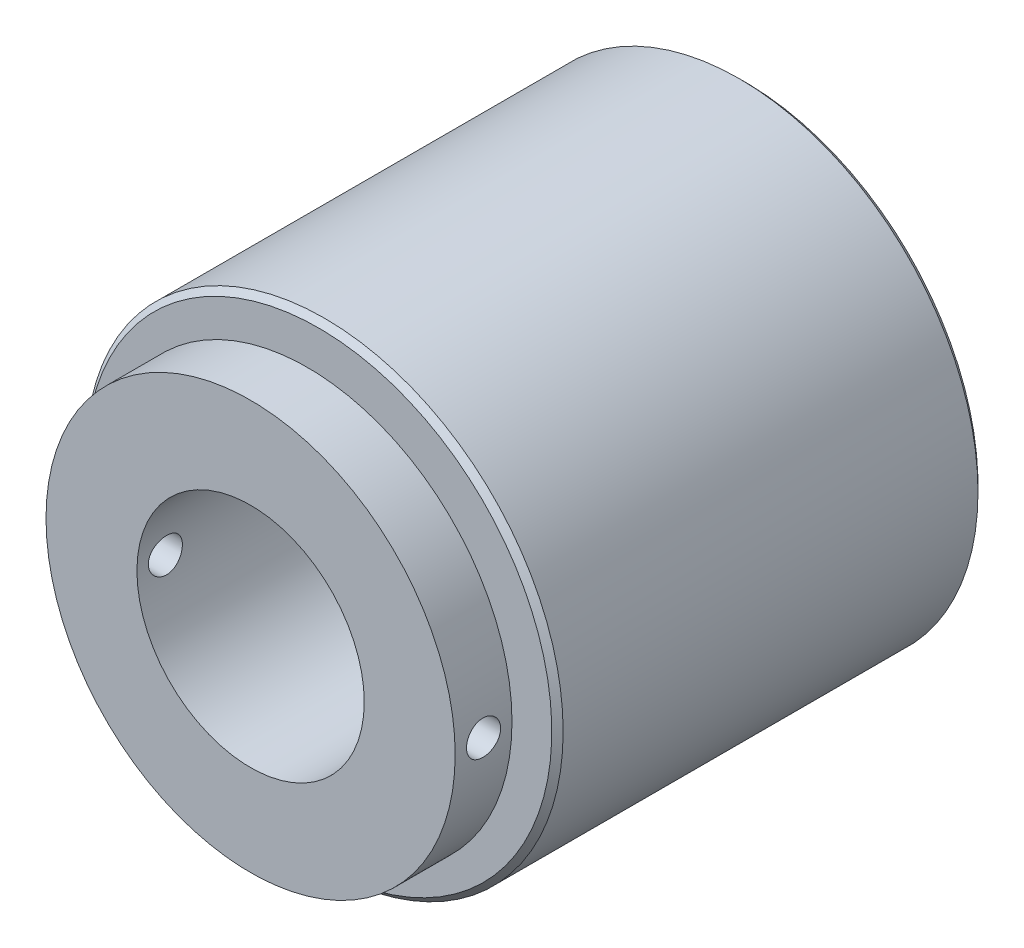
ISO-10303-21;
HEADER;
FILE_DESCRIPTION(('STEP AP214'),'2;1');
FILE_NAME('part.step','',(''),(''),'','','');
FILE_SCHEMA(('AUTOMOTIVE_DESIGN { 1 0 10303 214 1 1 1 1 }'));
ENDSEC;
DATA;
#1=APPLICATION_CONTEXT('core data for automotive mechanical design processes');
#2=APPLICATION_PROTOCOL_DEFINITION('international standard','automotive_design',2000,#1);
#3=PRODUCT_CONTEXT('',#1,'mechanical');
#4=PRODUCT('Part','Part','',(#3));
#5=PRODUCT_RELATED_PRODUCT_CATEGORY('part','',(#4));
#6=PRODUCT_DEFINITION_FORMATION('','',#4);
#7=PRODUCT_DEFINITION_CONTEXT('part definition',#1,'design');
#8=PRODUCT_DEFINITION('design','',#6,#7);
#9=PRODUCT_DEFINITION_SHAPE('','',#8);
#10=(LENGTH_UNIT() NAMED_UNIT(*) SI_UNIT(.MILLI.,.METRE.));
#11=(NAMED_UNIT(*) PLANE_ANGLE_UNIT() SI_UNIT($,.RADIAN.));
#12=(NAMED_UNIT(*) SI_UNIT($,.STERADIAN.) SOLID_ANGLE_UNIT());
#13=UNCERTAINTY_MEASURE_WITH_UNIT(LENGTH_MEASURE(1.E-05),#10,'distance_accuracy_value','');
#14=(GEOMETRIC_REPRESENTATION_CONTEXT(3) GLOBAL_UNCERTAINTY_ASSIGNED_CONTEXT((#13)) GLOBAL_UNIT_ASSIGNED_CONTEXT((#10,
#11,#12)) REPRESENTATION_CONTEXT('',''));
#15=CARTESIAN_POINT('',(0.,0.,0.));
#16=DIRECTION('',(0.,0.,1.));
#17=DIRECTION('',(1.,0.,0.));
#18=AXIS2_PLACEMENT_3D('',#15,#16,#17);
#19=CARTESIAN_POINT('',(0.,0.,5.));
#20=DIRECTION('',(0.,0.,-1.));
#21=DIRECTION('',(-1.,0.,0.));
#22=AXIS2_PLACEMENT_3D('',#19,#20,#21);
#23=CYLINDRICAL_SURFACE('',#22,18.);
#24=CARTESIAN_POINT('',(0.,0.,5.));
#25=DIRECTION('',(0.,0.,1.));
#26=DIRECTION('',(1.,0.,0.));
#27=AXIS2_PLACEMENT_3D('',#24,#25,#26);
#28=CIRCLE('',#27,18.);
#29=CARTESIAN_POINT('',(18.,0.,5.));
#30=VERTEX_POINT('',#29);
#31=EDGE_CURVE('E225',#30,#30,#28,.T.);
#32=ORIENTED_EDGE('',*,*,#31,.F.);
#33=EDGE_LOOP('',(#32));
#34=FACE_BOUND('',#33,.T.);
#35=CARTESIAN_POINT('',(0.,0.,0.));
#36=DIRECTION('',(0.,0.,1.));
#37=DIRECTION('',(1.,0.,0.));
#38=AXIS2_PLACEMENT_3D('',#35,#36,#37);
#39=CIRCLE('',#38,18.);
#40=CARTESIAN_POINT('',(18.,0.,0.));
#41=VERTEX_POINT('',#40);
#42=EDGE_CURVE('E223',#41,#41,#39,.T.);
#43=ORIENTED_EDGE('',*,*,#42,.T.);
#44=EDGE_LOOP('',(#43));
#45=FACE_BOUND('',#44,.T.);
#46=CARTESIAN_POINT('',(18.,0.,4.));
#47=CARTESIAN_POINT('',(17.9999991811727,-0.0840991348818064,3.99999632676058));
#48=CARTESIAN_POINT('',(17.9994043281509,-0.168255520770338,3.99290354528343));
#49=CARTESIAN_POINT('',(17.9970885349237,-0.334239856050584,3.96471347221738));
#50=CARTESIAN_POINT('',(17.9953663189754,-0.416065057837845,3.94360031454265));
#51=CARTESIAN_POINT('',(17.9909904186916,-0.574959033771391,3.88798426928595));
#52=CARTESIAN_POINT('',(17.9883372614773,-0.652030470636923,3.85348895783527));
#53=CARTESIAN_POINT('',(17.9823970161707,-0.799270850124114,3.77210135219201));
#54=CARTESIAN_POINT('',(17.9791100637204,-0.869441264828083,3.72521170978374));
#55=CARTESIAN_POINT('',(17.9722616980007,-1.00108499994839,3.62023740009101));
#56=CARTESIAN_POINT('',(17.9686996812986,-1.06253830862424,3.56212767409647));
#57=CARTESIAN_POINT('',(17.9617077120475,-1.17483170030483,3.4364156562251));
#58=CARTESIAN_POINT('',(17.9582777653056,-1.22567131705726,3.36881294754607));
#59=CARTESIAN_POINT('',(17.9519317899186,-1.31536188358534,3.22591282435146));
#60=CARTESIAN_POINT('',(17.9490165177014,-1.35419524942731,3.15060433689584));
#61=CARTESIAN_POINT('',(17.9440368667241,-1.41865865066077,2.99450755666603));
#62=CARTESIAN_POINT('',(17.9419724729345,-1.44428891926863,2.91371936071262));
#63=CARTESIAN_POINT('',(17.9389333809948,-1.48156054472786,2.74915691217823));
#64=CARTESIAN_POINT('',(17.9379561440433,-1.49323449808466,2.6653900900111));
#65=CARTESIAN_POINT('',(17.9371939848221,-1.50236281202314,2.49708069408195));
#66=CARTESIAN_POINT('',(17.9374090401759,-1.49981743946931,2.4125381349085));
#67=CARTESIAN_POINT('',(17.9390048604246,-1.48060629632227,2.24530050173422));
#68=CARTESIAN_POINT('',(17.9403827006678,-1.46397595205709,2.16260132638538));
#69=CARTESIAN_POINT('',(17.9441442535405,-1.41712197807441,2.00117219891057));
#70=CARTESIAN_POINT('',(17.946527975994,-1.38689821559518,1.92244228555922));
#71=CARTESIAN_POINT('',(17.9520360706028,-1.31367568222805,1.77107364118285));
#72=CARTESIAN_POINT('',(17.9551613632645,-1.27066101713579,1.69844263361874));
#73=CARTESIAN_POINT('',(17.9617996029582,-1.17308916587002,1.56141799177029));
#74=CARTESIAN_POINT('',(17.9653125578405,-1.11853174593381,1.49702452435418));
#75=CARTESIAN_POINT('',(17.9723433061747,-0.999224373339545,1.37809687107765));
#76=CARTESIAN_POINT('',(17.975861081626,-0.934443794085863,1.32359340380612));
#77=CARTESIAN_POINT('',(17.9824948780475,-0.796635834557626,1.22623041491717));
#78=CARTESIAN_POINT('',(17.9856108987493,-0.723608448773006,1.18337090107966));
#79=CARTESIAN_POINT('',(17.9910906871446,-0.571359889901777,1.11051435599694));
#80=CARTESIAN_POINT('',(17.9934543752616,-0.492138062713611,1.08051868528277));
#81=CARTESIAN_POINT('',(17.997162261177,-0.329758603529373,1.03426280132301));
#82=CARTESIAN_POINT('',(17.9985064801333,-0.246601053253283,1.01800230301711));
#83=CARTESIAN_POINT('',(18.0000212541458,-0.0789769502463765,0.999716853937632));
#84=CARTESIAN_POINT('',(18.00019530738,0.00548494367279381,0.997649472839654));
#85=CARTESIAN_POINT('',(17.9993594816805,0.173554128754955,1.00769779094097));
#86=CARTESIAN_POINT('',(17.9983496137901,0.257161427882119,1.01981335784419));
#87=CARTESIAN_POINT('',(17.9952617676198,0.421027134337049,1.05784848791514));
#88=CARTESIAN_POINT('',(17.9931853112613,0.501290137709583,1.08374838403872));
#89=CARTESIAN_POINT('',(17.9881975516853,0.656331247623733,1.14859688167304));
#90=CARTESIAN_POINT('',(17.9852862352686,0.731109267424698,1.18754568948775));
#91=CARTESIAN_POINT('',(17.9789463959045,0.87325082745286,1.27749302382453));
#92=CARTESIAN_POINT('',(17.9755166732811,0.940596525782204,1.32851965959224));
#93=CARTESIAN_POINT('',(17.9685293795955,1.06578164226543,1.44113358557572));
#94=CARTESIAN_POINT('',(17.9649718063129,1.12362089522157,1.5027210592739));
#95=CARTESIAN_POINT('',(17.9581194182373,1.22829681818265,1.63489253829751));
#96=CARTESIAN_POINT('',(17.9548252781133,1.27510579985046,1.7054985117961));
#97=CARTESIAN_POINT('',(17.9488822761648,1.35620259425928,1.85359339429512));
#98=CARTESIAN_POINT('',(17.9462334078977,1.39049053201495,1.93108223456491));
#99=CARTESIAN_POINT('',(17.9418846427341,1.44552476616085,2.09064518580886));
#100=CARTESIAN_POINT('',(17.9401835584295,1.46628801217393,2.1727134170715));
#101=CARTESIAN_POINT('',(17.9379189853628,1.49373865486523,2.33918604981164));
#102=CARTESIAN_POINT('',(17.9373554747545,1.5004263218524,2.42359040639439));
#103=CARTESIAN_POINT('',(17.9374301692529,1.4995328443364,2.59206418903134));
#104=CARTESIAN_POINT('',(17.938064710396,1.49199520466609,2.67613385085466));
#105=CARTESIAN_POINT('',(17.9404562262346,1.46295579494255,2.84180880032628));
#106=CARTESIAN_POINT('',(17.9422132026419,1.44145400359144,2.92341408421576));
#107=CARTESIAN_POINT('',(17.9466506569756,1.38510766502559,3.08184664489993));
#108=CARTESIAN_POINT('',(17.9493310806928,1.3502639010098,3.15867420184853));
#109=CARTESIAN_POINT('',(17.955313498126,1.26822758842088,3.3053962608605));
#110=CARTESIAN_POINT('',(17.9586154820857,1.22103523367184,3.37529087171999));
#111=CARTESIAN_POINT('',(17.9654809754802,1.11547791318367,3.50638560851952));
#112=CARTESIAN_POINT('',(17.9690452200862,1.05708074061219,3.56755976298602));
#113=CARTESIAN_POINT('',(17.9760269251452,0.930829838388698,3.67926277780498));
#114=CARTESIAN_POINT('',(17.9794443498724,0.862973823961637,3.72978905874402));
#115=CARTESIAN_POINT('',(17.9857535226341,0.719600659544122,3.81882979062634));
#116=CARTESIAN_POINT('',(17.9886442803466,0.644069484405807,3.85732170798449));
#117=CARTESIAN_POINT('',(17.9935627877445,0.4876436279936,3.92102770457692));
#118=CARTESIAN_POINT('',(17.9955915289238,0.406755233120476,3.94625704643216));
#119=CARTESIAN_POINT('',(17.9980366160078,0.271158072145019,3.97629637375307));
#120=CARTESIAN_POINT('',(17.9987695331543,0.217321341657706,3.98517341877623));
#121=CARTESIAN_POINT('',(17.9997514898795,0.108997757251744,3.99702641451581));
#122=CARTESIAN_POINT('',(18.0000005307429,0.0545109050595675,4.0000023808997));
#123=CARTESIAN_POINT('',(18.,0.,4.));
#124=B_SPLINE_CURVE_WITH_KNOTS('',3,(#46,#47,#48,#49,#50,#51,#52,#53,#54,#55,#56,#57,#58,#59,
#60,#61,#62,#63,#64,#65,#66,#67,#68,#69,#70,#71,#72,#73,#74,#75,#76,#77,#78,#79,#80,#81,#82,#83,
#84,#85,#86,#87,#88,#89,#90,#91,#92,#93,#94,#95,#96,#97,#98,#99,#100,#101,#102,#103,#104,#105,
#106,#107,#108,#109,#110,#111,#112,#113,#114,#115,#116,#117,#118,#119,#120,#121,#122,#123),
.UNSPECIFIED.,.T.,.F.,(4,2,2,2,2,2,2,2,2,2,2,2,2,2,2,2,2,2,2,2,2,2,2,2,2,2,2,2,2,2,2,2,2,2,2,2,
2,2,4),(0.,0.252098380200209,0.504482533496753,0.756724010833431,1.00891156437627,
1.26166900317865,1.51443754310897,1.76757454426637,2.02070707391851,2.2732472224738,
2.52578263143928,2.77768474665434,3.02958932215498,3.28180823623349,3.5340322587129,
3.78702676402724,4.04002143837967,4.29304286385676,4.54605903798802,4.79831848960753,
5.05057558821332,5.30247373546178,5.55437586542058,5.8068701246239,6.05936877106876,
6.31249464736803,6.56561799629742,6.81842350861393,7.07122416598137,7.32325294323791,
7.5752821048851,7.82729647421284,8.07930688814784,8.33205282996958,8.58485992848721,
8.8381375959383,9.09112314887678,9.25452729534993,9.41793100798119),.UNSPECIFIED.);
#125=CARTESIAN_POINT('',(18.,0.,4.));
#126=VERTEX_POINT('',#125);
#127=EDGE_CURVE('E88',#126,#126,#124,.T.);
#128=ORIENTED_EDGE('',*,*,#127,.F.);
#129=EDGE_LOOP('',(#128));
#130=FACE_BOUND('',#129,.T.);
#131=CARTESIAN_POINT('',(-18.,0.,4.));
#132=CARTESIAN_POINT('',(-17.9999991811727,0.0840991348818064,3.99999632676058));
#133=CARTESIAN_POINT('',(-17.9994043281509,0.168255520770338,3.99290354528343));
#134=CARTESIAN_POINT('',(-17.9970885349237,0.334239856050584,3.96471347221738));
#135=CARTESIAN_POINT('',(-17.9953663189754,0.416065057837845,3.94360031454265));
#136=CARTESIAN_POINT('',(-17.9909904186916,0.574959033771391,3.88798426928595));
#137=CARTESIAN_POINT('',(-17.9883372614773,0.652030470636923,3.85348895783527));
#138=CARTESIAN_POINT('',(-17.9823970161707,0.799270850124114,3.77210135219201));
#139=CARTESIAN_POINT('',(-17.9791100637204,0.869441264828083,3.72521170978374));
#140=CARTESIAN_POINT('',(-17.9722616980007,1.00108499994839,3.62023740009101));
#141=CARTESIAN_POINT('',(-17.9686996812986,1.06253830862424,3.56212767409647));
#142=CARTESIAN_POINT('',(-17.9617077120475,1.17483170030483,3.4364156562251));
#143=CARTESIAN_POINT('',(-17.9582777653056,1.22567131705726,3.36881294754607));
#144=CARTESIAN_POINT('',(-17.9519317899186,1.31536188358534,3.22591282435146));
#145=CARTESIAN_POINT('',(-17.9490165177014,1.35419524942731,3.15060433689584));
#146=CARTESIAN_POINT('',(-17.9440368667241,1.41865865066077,2.99450755666603));
#147=CARTESIAN_POINT('',(-17.9419724729345,1.44428891926863,2.91371936071262));
#148=CARTESIAN_POINT('',(-17.9389333809948,1.48156054472786,2.74915691217823));
#149=CARTESIAN_POINT('',(-17.9379561440433,1.49323449808466,2.6653900900111));
#150=CARTESIAN_POINT('',(-17.9371939848221,1.50236281202314,2.49708069408195));
#151=CARTESIAN_POINT('',(-17.9374090401759,1.49981743946931,2.4125381349085));
#152=CARTESIAN_POINT('',(-17.9390048604246,1.48060629632227,2.24530050173422));
#153=CARTESIAN_POINT('',(-17.9403827006678,1.46397595205709,2.16260132638538));
#154=CARTESIAN_POINT('',(-17.9441442535405,1.41712197807441,2.00117219891057));
#155=CARTESIAN_POINT('',(-17.946527975994,1.38689821559518,1.92244228555922));
#156=CARTESIAN_POINT('',(-17.9520360706028,1.31367568222805,1.77107364118285));
#157=CARTESIAN_POINT('',(-17.9551613632645,1.27066101713579,1.69844263361874));
#158=CARTESIAN_POINT('',(-17.9617996029582,1.17308916587002,1.56141799177029));
#159=CARTESIAN_POINT('',(-17.9653125578405,1.11853174593381,1.49702452435418));
#160=CARTESIAN_POINT('',(-17.9723433061747,0.999224373339545,1.37809687107765));
#161=CARTESIAN_POINT('',(-17.975861081626,0.934443794085863,1.32359340380612));
#162=CARTESIAN_POINT('',(-17.9824948780475,0.796635834557626,1.22623041491717));
#163=CARTESIAN_POINT('',(-17.9856108987493,0.723608448773006,1.18337090107966));
#164=CARTESIAN_POINT('',(-17.9910906871446,0.571359889901777,1.11051435599694));
#165=CARTESIAN_POINT('',(-17.9934543752616,0.492138062713611,1.08051868528277));
#166=CARTESIAN_POINT('',(-17.997162261177,0.329758603529373,1.03426280132301));
#167=CARTESIAN_POINT('',(-17.9985064801333,0.246601053253283,1.01800230301711));
#168=CARTESIAN_POINT('',(-18.0000212541458,0.0789769502463765,0.999716853937632));
#169=CARTESIAN_POINT('',(-18.00019530738,-0.00548494367279381,0.997649472839654));
#170=CARTESIAN_POINT('',(-17.9993594816805,-0.173554128754955,1.00769779094097));
#171=CARTESIAN_POINT('',(-17.9983496137901,-0.257161427882119,1.01981335784419));
#172=CARTESIAN_POINT('',(-17.9952617676198,-0.421027134337049,1.05784848791514));
#173=CARTESIAN_POINT('',(-17.9931853112613,-0.501290137709583,1.08374838403872));
#174=CARTESIAN_POINT('',(-17.9881975516853,-0.656331247623733,1.14859688167304));
#175=CARTESIAN_POINT('',(-17.9852862352686,-0.731109267424698,1.18754568948775));
#176=CARTESIAN_POINT('',(-17.9789463959045,-0.87325082745286,1.27749302382453));
#177=CARTESIAN_POINT('',(-17.9755166732811,-0.940596525782204,1.32851965959224));
#178=CARTESIAN_POINT('',(-17.9685293795955,-1.06578164226543,1.44113358557572));
#179=CARTESIAN_POINT('',(-17.9649718063129,-1.12362089522157,1.5027210592739));
#180=CARTESIAN_POINT('',(-17.9581194182373,-1.22829681818265,1.63489253829751));
#181=CARTESIAN_POINT('',(-17.9548252781133,-1.27510579985046,1.7054985117961));
#182=CARTESIAN_POINT('',(-17.9488822761648,-1.35620259425928,1.85359339429512));
#183=CARTESIAN_POINT('',(-17.9462334078977,-1.39049053201495,1.93108223456491));
#184=CARTESIAN_POINT('',(-17.9418846427341,-1.44552476616085,2.09064518580886));
#185=CARTESIAN_POINT('',(-17.9401835584295,-1.46628801217393,2.1727134170715));
#186=CARTESIAN_POINT('',(-17.9379189853628,-1.49373865486523,2.33918604981164));
#187=CARTESIAN_POINT('',(-17.9373554747545,-1.5004263218524,2.42359040639439));
#188=CARTESIAN_POINT('',(-17.9374301692529,-1.4995328443364,2.59206418903134));
#189=CARTESIAN_POINT('',(-17.938064710396,-1.49199520466609,2.67613385085466));
#190=CARTESIAN_POINT('',(-17.9404562262346,-1.46295579494255,2.84180880032628));
#191=CARTESIAN_POINT('',(-17.9422132026419,-1.44145400359144,2.92341408421576));
#192=CARTESIAN_POINT('',(-17.9466506569756,-1.38510766502559,3.08184664489993));
#193=CARTESIAN_POINT('',(-17.9493310806928,-1.3502639010098,3.15867420184853));
#194=CARTESIAN_POINT('',(-17.955313498126,-1.26822758842088,3.3053962608605));
#195=CARTESIAN_POINT('',(-17.9586154820857,-1.22103523367184,3.37529087171999));
#196=CARTESIAN_POINT('',(-17.9654809754802,-1.11547791318367,3.50638560851952));
#197=CARTESIAN_POINT('',(-17.9690452200862,-1.05708074061219,3.56755976298602));
#198=CARTESIAN_POINT('',(-17.9760269251452,-0.930829838388698,3.67926277780498));
#199=CARTESIAN_POINT('',(-17.9794443498724,-0.862973823961637,3.72978905874402));
#200=CARTESIAN_POINT('',(-17.9857535226341,-0.719600659544122,3.81882979062634));
#201=CARTESIAN_POINT('',(-17.9886442803466,-0.644069484405807,3.85732170798449));
#202=CARTESIAN_POINT('',(-17.9935627877445,-0.4876436279936,3.92102770457692));
#203=CARTESIAN_POINT('',(-17.9955915289238,-0.406755233120476,3.94625704643216));
#204=CARTESIAN_POINT('',(-17.9980366160078,-0.271158072145019,3.97629637375307));
#205=CARTESIAN_POINT('',(-17.9987695331543,-0.217321341657706,3.98517341877623));
#206=CARTESIAN_POINT('',(-17.9997514898795,-0.108997757251744,3.99702641451581));
#207=CARTESIAN_POINT('',(-18.0000005307429,-0.0545109050595675,4.0000023808997));
#208=CARTESIAN_POINT('',(-18.,0.,4.));
#209=B_SPLINE_CURVE_WITH_KNOTS('',3,(#131,#132,#133,#134,#135,#136,#137,#138,#139,#140,#141,
#142,#143,#144,#145,#146,#147,#148,#149,#150,#151,#152,#153,#154,#155,#156,#157,#158,#159,#160,
#161,#162,#163,#164,#165,#166,#167,#168,#169,#170,#171,#172,#173,#174,#175,#176,#177,#178,#179,
#180,#181,#182,#183,#184,#185,#186,#187,#188,#189,#190,#191,#192,#193,#194,#195,#196,#197,#198,
#199,#200,#201,#202,#203,#204,#205,#206,#207,#208),.UNSPECIFIED.,.T.,.F.,(4,2,2,2,2,2,2,2,2,2,2,
2,2,2,2,2,2,2,2,2,2,2,2,2,2,2,2,2,2,2,2,2,2,2,2,2,2,2,4),(0.,0.252098380200209,
0.504482533496753,0.756724010833431,1.00891156437627,1.26166900317865,1.51443754310897,
1.76757454426637,2.02070707391851,2.2732472224738,2.52578263143928,2.77768474665434,
3.02958932215498,3.28180823623349,3.5340322587129,3.78702676402724,4.04002143837967,
4.29304286385676,4.54605903798802,4.79831848960753,5.05057558821332,5.30247373546178,
5.55437586542058,5.8068701246239,6.05936877106876,6.31249464736803,6.56561799629742,
6.81842350861393,7.07122416598137,7.32325294323791,7.5752821048851,7.82729647421284,
8.07930688814784,8.33205282996958,8.58485992848721,8.8381375959383,9.09112314887678,
9.25452729534993,9.41793100798119),.UNSPECIFIED.);
#210=CARTESIAN_POINT('',(-18.,0.,4.));
#211=VERTEX_POINT('',#210);
#212=EDGE_CURVE('E113',#211,#211,#209,.T.);
#213=ORIENTED_EDGE('',*,*,#212,.F.);
#214=EDGE_LOOP('',(#213));
#215=FACE_BOUND('',#214,.T.);
#216=ADVANCED_FACE('F51',(#34,#45,#130,#215),#23,.T.);
#217=CARTESIAN_POINT('',(0.,0.,5.));
#218=DIRECTION('',(0.,0.,-1.));
#219=DIRECTION('',(-1.,0.,0.));
#220=AXIS2_PLACEMENT_3D('',#217,#218,#219);
#221=CYLINDRICAL_SURFACE('',#220,10.);
#222=CARTESIAN_POINT('',(10.,0.,4.));
#223=CARTESIAN_POINT('',(9.99999865771297,-0.0837515444816421,3.99999654618476));
#224=CARTESIAN_POINT('',(9.9989368253704,-0.167551685082132,3.99296199915937));
#225=CARTESIAN_POINT('',(9.99480315973187,-0.332809627994913,3.96501680001725));
#226=CARTESIAN_POINT('',(9.99172936938473,-0.414265068974229,3.94409263705511));
#227=CARTESIAN_POINT('',(9.98391721219526,-0.57241808622186,3.88900749503238));
#228=CARTESIAN_POINT('',(9.97918010370919,-0.649119207826799,3.85485652049405));
#229=CARTESIAN_POINT('',(9.96856475911724,-0.795690428635254,3.77431162058314));
#230=CARTESIAN_POINT('',(9.96268668152773,-0.865561474725188,3.72791939558264));
#231=CARTESIAN_POINT('',(9.95039170991452,-0.997046719562126,3.62382273506013));
#232=CARTESIAN_POINT('',(9.94397133890331,-1.0585998322255,3.5660415437918));
#233=CARTESIAN_POINT('',(9.93134261133238,-1.17117490668948,3.44097231110613));
#234=CARTESIAN_POINT('',(9.92513426698505,-1.22219626272936,3.37368372322148));
#235=CARTESIAN_POINT('',(9.91359877458726,-1.31249729499943,3.23109935647751));
#236=CARTESIAN_POINT('',(9.90827611975031,-1.35171787037205,3.15576575301866));
#237=CARTESIAN_POINT('',(9.89916211306268,-1.41692632171056,2.99948717935457));
#238=CARTESIAN_POINT('',(9.89537067775449,-1.44291491889163,2.91854251525611));
#239=CARTESIAN_POINT('',(9.88978256218673,-1.48073198798911,2.75398195812829));
#240=CARTESIAN_POINT('',(9.8879711574125,-1.49266503640518,2.67039060659198));
#241=CARTESIAN_POINT('',(9.88650348970582,-1.50235624033932,2.50237383401272));
#242=CARTESIAN_POINT('',(9.88684710303147,-1.50011520973796,2.41794846113751));
#243=CARTESIAN_POINT('',(9.88963718352409,-1.48160733250788,2.25139891980586));
#244=CARTESIAN_POINT('',(9.89206618761549,-1.4654569592775,2.1692614735152));
#245=CARTESIAN_POINT('',(9.89872608126367,-1.41977117403734,2.00887563112847));
#246=CARTESIAN_POINT('',(9.90295702179379,-1.39023538337812,1.93062734511926));
#247=CARTESIAN_POINT('',(9.91276335545481,-1.31849603529736,1.77988662871714));
#248=CARTESIAN_POINT('',(9.91834396766526,-1.27624314283198,1.70741803090761));
#249=CARTESIAN_POINT('',(9.93021707574548,-1.18030413128955,1.57055540421807));
#250=CARTESIAN_POINT('',(9.93650961832501,-1.12661726182478,1.50616190573063));
#251=CARTESIAN_POINT('',(9.94917473056209,-1.00869493078248,1.38660233926028));
#252=CARTESIAN_POINT('',(9.95554747112815,-0.944359329642002,1.33153500971366));
#253=CARTESIAN_POINT('',(9.96759647648462,-0.807307089894186,1.23296406549274));
#254=CARTESIAN_POINT('',(9.9732727382251,-0.73459041458817,1.1894605014561));
#255=CARTESIAN_POINT('',(9.98329515585393,-0.582754598213686,1.11524691350045));
#256=CARTESIAN_POINT('',(9.98764051925428,-0.50363167783678,1.0845445081597));
#257=CARTESIAN_POINT('',(9.99450490557069,-0.34127318248706,1.03689061031463));
#258=CARTESIAN_POINT('',(9.99702405195467,-0.2580378859526,1.01993818818442));
#259=CARTESIAN_POINT('',(9.99993581133871,-0.0906695676436464,1.00039677018331));
#260=CARTESIAN_POINT('',(10.0003485209039,-0.00655273187047067,0.997672028620676));
#261=CARTESIAN_POINT('',(9.99905561015226,0.160936677662282,1.00630300531102));
#262=CARTESIAN_POINT('',(9.99735005541368,0.244309274381877,1.0176582876681));
#263=CARTESIAN_POINT('',(9.99202468615333,0.407532387431408,1.05401410017754));
#264=CARTESIAN_POINT('',(9.98841415207984,0.487397963079838,1.07894849603085));
#265=CARTESIAN_POINT('',(9.97968235658369,0.641814958642999,1.14168499746176));
#266=CARTESIAN_POINT('',(9.97456102421565,0.7163661287951,1.17948770733363));
#267=CARTESIAN_POINT('',(9.96332682468686,0.858634979291921,1.26720622456386));
#268=CARTESIAN_POINT('',(9.95720701626745,0.926299009891566,1.31720814001277));
#269=CARTESIAN_POINT('',(9.94467863012165,1.05232367317771,1.42778581162875));
#270=CARTESIAN_POINT('',(9.93827003562867,1.1106837647934,1.48836218232465));
#271=CARTESIAN_POINT('',(9.92582264304494,1.21693784957195,1.61897353317649));
#272=CARTESIAN_POINT('',(9.91978736017588,1.26474084747421,1.68908292519477));
#273=CARTESIAN_POINT('',(9.90883219104903,1.34789129270584,1.83641604051177));
#274=CARTESIAN_POINT('',(9.90391227465628,1.38323907656436,1.91363957152146));
#275=CARTESIAN_POINT('',(9.89577033008645,1.44033467323943,2.07273753362313));
#276=CARTESIAN_POINT('',(9.89254233006438,1.46213037141635,2.15459446097124));
#277=CARTESIAN_POINT('',(9.88813382297802,1.49165549501586,2.32085901543511));
#278=CARTESIAN_POINT('',(9.88695317451771,1.49938589183067,2.40526646599467));
#279=CARTESIAN_POINT('',(9.88677832610841,1.5005378666944,2.57332906331578));
#280=CARTESIAN_POINT('',(9.88776226333502,1.49410252167313,2.65698324175692));
#281=CARTESIAN_POINT('',(9.89175820611174,1.46741229544379,2.82200526332352));
#282=CARTESIAN_POINT('',(9.89477020841118,1.44715743638627,2.90337311011339));
#283=CARTESIAN_POINT('',(9.90247526112297,1.39345373518665,3.06147308223432));
#284=CARTESIAN_POINT('',(9.90716703716075,1.36001489324314,3.13820867043344));
#285=CARTESIAN_POINT('',(9.91770454557702,1.28090667642309,3.2850036338024));
#286=CARTESIAN_POINT('',(9.92355031702724,1.23523688741502,3.35506278280364));
#287=CARTESIAN_POINT('',(9.93580743364938,1.13244337659164,3.48724305797517));
#288=CARTESIAN_POINT('',(9.94222367881967,1.07521369039806,3.54928133324707));
#289=CARTESIAN_POINT('',(9.95485788826636,0.951148841082834,3.66292455478782));
#290=CARTESIAN_POINT('',(9.96107580610759,0.884311448350941,3.71452707257616));
#291=CARTESIAN_POINT('',(9.9726518579052,0.742495707543722,3.80608767660736));
#292=CARTESIAN_POINT('',(9.9780050712882,0.66747457676476,3.84598010921475));
#293=CARTESIAN_POINT('',(9.98720028802959,0.511751870248719,3.91253851675805));
#294=CARTESIAN_POINT('',(9.99104385565757,0.431056277096704,3.93921819005369));
#295=CARTESIAN_POINT('',(9.99590939261505,0.291665727889329,3.97254134271011));
#296=CARTESIAN_POINT('',(9.99743549179557,0.233831133495279,3.98282260153881));
#297=CARTESIAN_POINT('',(9.99948125947896,0.117338971600125,3.99655309771264));
#298=CARTESIAN_POINT('',(10.0000009404877,0.0586814143344173,4.00000241995255));
#299=CARTESIAN_POINT('',(10.,0.,4.));
#300=B_SPLINE_CURVE_WITH_KNOTS('',3,(#222,#223,#224,#225,#226,#227,#228,#229,#230,#231,#232,
#233,#234,#235,#236,#237,#238,#239,#240,#241,#242,#243,#244,#245,#246,#247,#248,#249,#250,#251,
#252,#253,#254,#255,#256,#257,#258,#259,#260,#261,#262,#263,#264,#265,#266,#267,#268,#269,#270,
#271,#272,#273,#274,#275,#276,#277,#278,#279,#280,#281,#282,#283,#284,#285,#286,#287,#288,#289,
#290,#291,#292,#293,#294,#295,#296,#297,#298,#299),.UNSPECIFIED.,.T.,.F.,(4,2,2,2,2,2,2,2,2,2,2,
2,2,2,2,2,2,2,2,2,2,2,2,2,2,2,2,2,2,2,2,2,2,2,2,2,2,2,4),(0.,0.251040205031663,0.50232496292915,
0.753420023583237,1.0044802241976,1.25729416136843,1.5101226357258,1.76419702395375,
2.01825756225506,2.27041564605924,2.52255925098982,2.77261177195746,3.02267136690361,
3.27371383476159,3.52477278308534,3.77834291255409,4.03191415238668,4.28563608984874,
4.53934087193401,4.79062058544255,5.04189251991155,5.29195148965948,5.54202220376273,
5.79391188036907,6.04581620028629,6.29981366584672,6.55380426808832,6.80689223457168,
7.05996272137176,7.31048888261064,7.56101464229564,7.81135073984146,8.06169531466879,
8.31444829965721,8.56726003468733,8.82146323384733,9.07540233261441,9.25129851978808,
9.42719252123291),.UNSPECIFIED.);
#301=CARTESIAN_POINT('',(10.,0.,4.));
#302=VERTEX_POINT('',#301);
#303=EDGE_CURVE('E87',#302,#302,#300,.T.);
#304=ORIENTED_EDGE('',*,*,#303,.T.);
#305=EDGE_LOOP('',(#304));
#306=FACE_BOUND('',#305,.T.);
#307=CARTESIAN_POINT('',(0.,0.,5.));
#308=DIRECTION('',(0.,0.,1.));
#309=DIRECTION('',(1.,0.,0.));
#310=AXIS2_PLACEMENT_3D('',#307,#308,#309);
#311=CIRCLE('',#310,10.);
#312=CARTESIAN_POINT('',(10.,0.,5.));
#313=VERTEX_POINT('',#312);
#314=EDGE_CURVE('E232',#313,#313,#311,.T.);
#315=ORIENTED_EDGE('',*,*,#314,.T.);
#316=EDGE_LOOP('',(#315));
#317=FACE_BOUND('',#316,.T.);
#318=CARTESIAN_POINT('',(-10.,0.,4.));
#319=CARTESIAN_POINT('',(-9.99999865771297,0.0837515444816421,3.99999654618476));
#320=CARTESIAN_POINT('',(-9.9989368253704,0.167551685082132,3.99296199915937));
#321=CARTESIAN_POINT('',(-9.99480315973187,0.332809627994913,3.96501680001725));
#322=CARTESIAN_POINT('',(-9.99172936938473,0.414265068974229,3.94409263705511));
#323=CARTESIAN_POINT('',(-9.98391721219526,0.57241808622186,3.88900749503238));
#324=CARTESIAN_POINT('',(-9.97918010370919,0.649119207826799,3.85485652049405));
#325=CARTESIAN_POINT('',(-9.96856475911724,0.795690428635254,3.77431162058314));
#326=CARTESIAN_POINT('',(-9.96268668152773,0.865561474725188,3.72791939558264));
#327=CARTESIAN_POINT('',(-9.95039170991452,0.997046719562126,3.62382273506013));
#328=CARTESIAN_POINT('',(-9.94397133890331,1.0585998322255,3.5660415437918));
#329=CARTESIAN_POINT('',(-9.93134261133238,1.17117490668948,3.44097231110613));
#330=CARTESIAN_POINT('',(-9.92513426698505,1.22219626272936,3.37368372322148));
#331=CARTESIAN_POINT('',(-9.91359877458726,1.31249729499943,3.23109935647751));
#332=CARTESIAN_POINT('',(-9.90827611975031,1.35171787037205,3.15576575301866));
#333=CARTESIAN_POINT('',(-9.89916211306268,1.41692632171056,2.99948717935457));
#334=CARTESIAN_POINT('',(-9.89537067775449,1.44291491889163,2.91854251525611));
#335=CARTESIAN_POINT('',(-9.88978256218673,1.48073198798911,2.75398195812829));
#336=CARTESIAN_POINT('',(-9.8879711574125,1.49266503640518,2.67039060659198));
#337=CARTESIAN_POINT('',(-9.88650348970582,1.50235624033932,2.50237383401272));
#338=CARTESIAN_POINT('',(-9.88684710303147,1.50011520973796,2.41794846113751));
#339=CARTESIAN_POINT('',(-9.88963718352409,1.48160733250788,2.25139891980586));
#340=CARTESIAN_POINT('',(-9.89206618761549,1.4654569592775,2.1692614735152));
#341=CARTESIAN_POINT('',(-9.89872608126367,1.41977117403734,2.00887563112847));
#342=CARTESIAN_POINT('',(-9.90295702179379,1.39023538337812,1.93062734511926));
#343=CARTESIAN_POINT('',(-9.91276335545481,1.31849603529736,1.77988662871714));
#344=CARTESIAN_POINT('',(-9.91834396766526,1.27624314283198,1.70741803090761));
#345=CARTESIAN_POINT('',(-9.93021707574548,1.18030413128955,1.57055540421807));
#346=CARTESIAN_POINT('',(-9.93650961832501,1.12661726182478,1.50616190573063));
#347=CARTESIAN_POINT('',(-9.94917473056209,1.00869493078248,1.38660233926028));
#348=CARTESIAN_POINT('',(-9.95554747112815,0.944359329642002,1.33153500971366));
#349=CARTESIAN_POINT('',(-9.96759647648462,0.807307089894186,1.23296406549274));
#350=CARTESIAN_POINT('',(-9.9732727382251,0.73459041458817,1.1894605014561));
#351=CARTESIAN_POINT('',(-9.98329515585393,0.582754598213686,1.11524691350045));
#352=CARTESIAN_POINT('',(-9.98764051925428,0.50363167783678,1.0845445081597));
#353=CARTESIAN_POINT('',(-9.99450490557069,0.34127318248706,1.03689061031463));
#354=CARTESIAN_POINT('',(-9.99702405195467,0.2580378859526,1.01993818818442));
#355=CARTESIAN_POINT('',(-9.99993581133871,0.0906695676436464,1.00039677018331));
#356=CARTESIAN_POINT('',(-10.0003485209039,0.00655273187047067,0.997672028620676));
#357=CARTESIAN_POINT('',(-9.99905561015226,-0.160936677662282,1.00630300531102));
#358=CARTESIAN_POINT('',(-9.99735005541368,-0.244309274381877,1.0176582876681));
#359=CARTESIAN_POINT('',(-9.99202468615333,-0.407532387431408,1.05401410017754));
#360=CARTESIAN_POINT('',(-9.98841415207984,-0.487397963079838,1.07894849603085));
#361=CARTESIAN_POINT('',(-9.97968235658369,-0.641814958642999,1.14168499746176));
#362=CARTESIAN_POINT('',(-9.97456102421565,-0.7163661287951,1.17948770733363));
#363=CARTESIAN_POINT('',(-9.96332682468686,-0.858634979291921,1.26720622456386));
#364=CARTESIAN_POINT('',(-9.95720701626745,-0.926299009891566,1.31720814001277));
#365=CARTESIAN_POINT('',(-9.94467863012165,-1.05232367317771,1.42778581162875));
#366=CARTESIAN_POINT('',(-9.93827003562867,-1.1106837647934,1.48836218232465));
#367=CARTESIAN_POINT('',(-9.92582264304494,-1.21693784957195,1.61897353317649));
#368=CARTESIAN_POINT('',(-9.91978736017588,-1.26474084747421,1.68908292519477));
#369=CARTESIAN_POINT('',(-9.90883219104903,-1.34789129270584,1.83641604051177));
#370=CARTESIAN_POINT('',(-9.90391227465628,-1.38323907656436,1.91363957152146));
#371=CARTESIAN_POINT('',(-9.89577033008645,-1.44033467323943,2.07273753362313));
#372=CARTESIAN_POINT('',(-9.89254233006438,-1.46213037141635,2.15459446097124));
#373=CARTESIAN_POINT('',(-9.88813382297802,-1.49165549501586,2.32085901543511));
#374=CARTESIAN_POINT('',(-9.88695317451771,-1.49938589183067,2.40526646599467));
#375=CARTESIAN_POINT('',(-9.88677832610841,-1.5005378666944,2.57332906331578));
#376=CARTESIAN_POINT('',(-9.88776226333502,-1.49410252167313,2.65698324175692));
#377=CARTESIAN_POINT('',(-9.89175820611174,-1.46741229544379,2.82200526332352));
#378=CARTESIAN_POINT('',(-9.89477020841118,-1.44715743638627,2.90337311011339));
#379=CARTESIAN_POINT('',(-9.90247526112297,-1.39345373518665,3.06147308223432));
#380=CARTESIAN_POINT('',(-9.90716703716075,-1.36001489324314,3.13820867043344));
#381=CARTESIAN_POINT('',(-9.91770454557702,-1.28090667642309,3.2850036338024));
#382=CARTESIAN_POINT('',(-9.92355031702724,-1.23523688741502,3.35506278280364));
#383=CARTESIAN_POINT('',(-9.93580743364938,-1.13244337659164,3.48724305797517));
#384=CARTESIAN_POINT('',(-9.94222367881967,-1.07521369039806,3.54928133324707));
#385=CARTESIAN_POINT('',(-9.95485788826636,-0.951148841082834,3.66292455478782));
#386=CARTESIAN_POINT('',(-9.96107580610759,-0.884311448350941,3.71452707257616));
#387=CARTESIAN_POINT('',(-9.9726518579052,-0.742495707543722,3.80608767660736));
#388=CARTESIAN_POINT('',(-9.9780050712882,-0.66747457676476,3.84598010921475));
#389=CARTESIAN_POINT('',(-9.98720028802959,-0.511751870248719,3.91253851675805));
#390=CARTESIAN_POINT('',(-9.99104385565757,-0.431056277096704,3.93921819005369));
#391=CARTESIAN_POINT('',(-9.99590939261505,-0.291665727889329,3.97254134271011));
#392=CARTESIAN_POINT('',(-9.99743549179557,-0.233831133495279,3.98282260153881));
#393=CARTESIAN_POINT('',(-9.99948125947896,-0.117338971600125,3.99655309771264));
#394=CARTESIAN_POINT('',(-10.0000009404877,-0.0586814143344173,4.00000241995255));
#395=CARTESIAN_POINT('',(-10.,0.,4.));
#396=B_SPLINE_CURVE_WITH_KNOTS('',3,(#318,#319,#320,#321,#322,#323,#324,#325,#326,#327,#328,
#329,#330,#331,#332,#333,#334,#335,#336,#337,#338,#339,#340,#341,#342,#343,#344,#345,#346,#347,
#348,#349,#350,#351,#352,#353,#354,#355,#356,#357,#358,#359,#360,#361,#362,#363,#364,#365,#366,
#367,#368,#369,#370,#371,#372,#373,#374,#375,#376,#377,#378,#379,#380,#381,#382,#383,#384,#385,
#386,#387,#388,#389,#390,#391,#392,#393,#394,#395),.UNSPECIFIED.,.T.,.F.,(4,2,2,2,2,2,2,2,2,2,2,
2,2,2,2,2,2,2,2,2,2,2,2,2,2,2,2,2,2,2,2,2,2,2,2,2,2,2,4),(0.,0.251040205031663,0.50232496292915,
0.753420023583237,1.0044802241976,1.25729416136843,1.5101226357258,1.76419702395375,
2.01825756225506,2.27041564605924,2.52255925098982,2.77261177195746,3.02267136690361,
3.27371383476159,3.52477278308534,3.77834291255409,4.03191415238668,4.28563608984874,
4.53934087193401,4.79062058544255,5.04189251991155,5.29195148965948,5.54202220376273,
5.79391188036907,6.04581620028629,6.29981366584672,6.55380426808832,6.80689223457168,
7.05996272137176,7.31048888261064,7.56101464229564,7.81135073984146,8.06169531466879,
8.31444829965721,8.56726003468733,8.82146323384733,9.07540233261441,9.25129851978808,
9.42719252123291),.UNSPECIFIED.);
#397=CARTESIAN_POINT('',(-10.,0.,4.));
#398=VERTEX_POINT('',#397);
#399=EDGE_CURVE('E80',#398,#398,#396,.T.);
#400=ORIENTED_EDGE('',*,*,#399,.T.);
#401=EDGE_LOOP('',(#400));
#402=FACE_BOUND('',#401,.T.);
#403=CARTESIAN_POINT('',(0.,0.,-38.5));
#404=DIRECTION('',(0.,0.,-1.));
#405=DIRECTION('',(-1.,0.,0.));
#406=AXIS2_PLACEMENT_3D('',#403,#404,#405);
#407=CIRCLE('',#406,10.);
#408=CARTESIAN_POINT('',(-10.,0.,-38.5));
#409=VERTEX_POINT('',#408);
#410=EDGE_CURVE('E151',#409,#409,#407,.T.);
#411=ORIENTED_EDGE('',*,*,#410,.T.);
#412=EDGE_LOOP('',(#411));
#413=FACE_BOUND('',#412,.T.);
#414=ADVANCED_FACE('F95',(#306,#317,#402,#413),#221,.F.);
#415=CARTESIAN_POINT('',(0.,0.,5.));
#416=DIRECTION('',(0.,0.,1.));
#417=DIRECTION('',(1.,0.,0.));
#418=AXIS2_PLACEMENT_3D('',#415,#416,#417);
#419=PLANE('',#418);
#420=ORIENTED_EDGE('',*,*,#31,.T.);
#421=EDGE_LOOP('',(#420));
#422=FACE_BOUND('',#421,.T.);
#423=ORIENTED_EDGE('',*,*,#314,.F.);
#424=EDGE_LOOP('',(#423));
#425=FACE_BOUND('',#424,.T.);
#426=ADVANCED_FACE('F251',(#422,#425),#419,.T.);
#427=CARTESIAN_POINT('',(0.,0.,0.));
#428=DIRECTION('',(0.,0.,1.));
#429=DIRECTION('',(1.,0.,0.));
#430=AXIS2_PLACEMENT_3D('',#427,#428,#429);
#431=PLANE('',#430);
#432=CARTESIAN_POINT('',(0.,0.,0.));
#433=DIRECTION('',(0.,0.,-1.));
#434=DIRECTION('',(-1.,0.,0.));
#435=AXIS2_PLACEMENT_3D('',#432,#433,#434);
#436=CIRCLE('',#435,10.4159445102154);
#437=CARTESIAN_POINT('',(-10.4159445102154,0.,0.));
#438=VERTEX_POINT('',#437);
#439=EDGE_CURVE('E77',#438,#438,#436,.T.);
#440=ORIENTED_EDGE('',*,*,#439,.F.);
#441=EDGE_LOOP('',(#440));
#442=FACE_BOUND('',#441,.T.);
#443=ORIENTED_EDGE('',*,*,#42,.F.);
#444=EDGE_LOOP('',(#443));
#445=FACE_BOUND('',#444,.T.);
#446=ADVANCED_FACE('F121',(#442,#445),#431,.F.);
#447=CARTESIAN_POINT('',(35.,0.,2.5));
#448=DIRECTION('',(-1.,0.,0.));
#449=DIRECTION('',(0.,0.,1.));
#450=AXIS2_PLACEMENT_3D('',#447,#448,#449);
#451=CYLINDRICAL_SURFACE('',#450,1.5);
#452=ORIENTED_EDGE('',*,*,#303,.F.);
#453=EDGE_LOOP('',(#452));
#454=FACE_BOUND('',#453,.T.);
#455=ORIENTED_EDGE('',*,*,#127,.T.);
#456=EDGE_LOOP('',(#455));
#457=FACE_BOUND('',#456,.T.);
#458=ADVANCED_FACE('F99',(#454,#457),#451,.F.);
#459=ORIENTED_EDGE('',*,*,#399,.F.);
#460=EDGE_LOOP('',(#459));
#461=FACE_BOUND('',#460,.T.);
#462=ORIENTED_EDGE('',*,*,#212,.T.);
#463=EDGE_LOOP('',(#462));
#464=FACE_BOUND('',#463,.T.);
#465=ADVANCED_FACE('F92',(#461,#464),#451,.F.);
#466=CARTESIAN_POINT('',(0.,0.,-1.));
#467=DIRECTION('',(0.,0.,1.));
#468=DIRECTION('',(1.,0.,0.));
#469=AXIS2_PLACEMENT_3D('',#466,#467,#468);
#470=CYLINDRICAL_SURFACE('',#469,10.4159445102154);
#471=CARTESIAN_POINT('',(0.,0.,-1.));
#472=DIRECTION('',(0.,0.,-1.));
#473=DIRECTION('',(-1.,0.,0.));
#474=AXIS2_PLACEMENT_3D('',#471,#472,#473);
#475=CIRCLE('',#474,10.4159445102154);
#476=CARTESIAN_POINT('',(-10.4159445102154,0.,-1.));
#477=VERTEX_POINT('',#476);
#478=EDGE_CURVE('E152',#477,#477,#475,.T.);
#479=ORIENTED_EDGE('',*,*,#478,.F.);
#480=EDGE_LOOP('',(#479));
#481=FACE_BOUND('',#480,.T.);
#482=ORIENTED_EDGE('',*,*,#439,.T.);
#483=EDGE_LOOP('',(#482));
#484=FACE_BOUND('',#483,.T.);
#485=ADVANCED_FACE('F97',(#481,#484),#470,.T.);
#486=CARTESIAN_POINT('',(0.,0.,-38.5));
#487=DIRECTION('',(0.,0.,-1.));
#488=DIRECTION('',(-1.,0.,0.));
#489=AXIS2_PLACEMENT_3D('',#486,#487,#488);
#490=PLANE('',#489);
#491=CARTESIAN_POINT('',(-3.,18.,-38.5));
#492=DIRECTION('',(0.,0.,-1.));
#493=DIRECTION('',(-1.,0.,0.));
#494=AXIS2_PLACEMENT_3D('',#491,#492,#493);
#495=CIRCLE('',#494,1.);
#496=CARTESIAN_POINT('',(-4.,18.,-38.5));
#497=VERTEX_POINT('',#496);
#498=EDGE_CURVE('E175',#497,#497,#495,.T.);
#499=ORIENTED_EDGE('',*,*,#498,.F.);
#500=EDGE_LOOP('',(#499));
#501=FACE_BOUND('',#500,.T.);
#502=CARTESIAN_POINT('',(3.,18.,-38.5));
#503=DIRECTION('',(0.,0.,-1.));
#504=DIRECTION('',(-1.,0.,0.));
#505=AXIS2_PLACEMENT_3D('',#502,#503,#504);
#506=CIRCLE('',#505,1.);
#507=CARTESIAN_POINT('',(2.,18.,-38.5));
#508=VERTEX_POINT('',#507);
#509=EDGE_CURVE('E176',#508,#508,#506,.T.);
#510=ORIENTED_EDGE('',*,*,#509,.F.);
#511=EDGE_LOOP('',(#510));
#512=FACE_BOUND('',#511,.T.);
#513=CARTESIAN_POINT('',(3.,-18.,-38.5));
#514=DIRECTION('',(0.,0.,-1.));
#515=DIRECTION('',(-1.,0.,0.));
#516=AXIS2_PLACEMENT_3D('',#513,#514,#515);
#517=CIRCLE('',#516,1.);
#518=CARTESIAN_POINT('',(2.,-18.,-38.5));
#519=VERTEX_POINT('',#518);
#520=EDGE_CURVE('E167',#519,#519,#517,.T.);
#521=ORIENTED_EDGE('',*,*,#520,.F.);
#522=EDGE_LOOP('',(#521));
#523=FACE_BOUND('',#522,.T.);
#524=CARTESIAN_POINT('',(-3.,-18.,-38.5));
#525=DIRECTION('',(0.,0.,-1.));
#526=DIRECTION('',(-1.,0.,0.));
#527=AXIS2_PLACEMENT_3D('',#524,#525,#526);
#528=CIRCLE('',#527,1.);
#529=CARTESIAN_POINT('',(-4.,-18.,-38.5));
#530=VERTEX_POINT('',#529);
#531=EDGE_CURVE('E161',#530,#530,#528,.T.);
#532=ORIENTED_EDGE('',*,*,#531,.F.);
#533=EDGE_LOOP('',(#532));
#534=FACE_BOUND('',#533,.T.);
#535=CARTESIAN_POINT('',(0.,0.,-38.5));
#536=DIRECTION('',(0.,0.,-1.));
#537=DIRECTION('',(-1.,0.,0.));
#538=AXIS2_PLACEMENT_3D('',#535,#536,#537);
#539=CIRCLE('',#538,20.5);
#540=CARTESIAN_POINT('',(-20.5,0.,-38.5));
#541=VERTEX_POINT('',#540);
#542=EDGE_CURVE('E66',#541,#541,#539,.T.);
#543=ORIENTED_EDGE('',*,*,#542,.T.);
#544=EDGE_LOOP('',(#543));
#545=FACE_BOUND('',#544,.T.);
#546=ORIENTED_EDGE('',*,*,#410,.F.);
#547=EDGE_LOOP('',(#546));
#548=FACE_BOUND('',#547,.T.);
#549=ADVANCED_FACE('F145',(#501,#512,#523,#534,#545,#548),#490,.T.);
#550=CARTESIAN_POINT('',(0.,0.,-1.));
#551=DIRECTION('',(0.,0.,-1.));
#552=DIRECTION('',(-1.,0.,0.));
#553=AXIS2_PLACEMENT_3D('',#550,#551,#552);
#554=PLANE('',#553);
#555=CARTESIAN_POINT('',(0.,0.,-1.));
#556=DIRECTION('',(0.,0.,-1.));
#557=DIRECTION('',(-1.,0.,0.));
#558=AXIS2_PLACEMENT_3D('',#555,#556,#557);
#559=CIRCLE('',#558,20.5);
#560=CARTESIAN_POINT('',(-20.5,0.,-1.));
#561=VERTEX_POINT('',#560);
#562=EDGE_CURVE('E11',#561,#561,#559,.F.);
#563=ORIENTED_EDGE('',*,*,#562,.T.);
#564=EDGE_LOOP('',(#563));
#565=FACE_BOUND('',#564,.T.);
#566=ORIENTED_EDGE('',*,*,#478,.T.);
#567=EDGE_LOOP('',(#566));
#568=FACE_BOUND('',#567,.T.);
#569=ADVANCED_FACE('F136',(#565,#568),#554,.F.);
#570=CARTESIAN_POINT('',(0.,0.,-38.5));
#571=DIRECTION('',(0.,0.,1.));
#572=DIRECTION('',(1.,0.,0.));
#573=AXIS2_PLACEMENT_3D('',#570,#571,#572);
#574=CYLINDRICAL_SURFACE('',#573,21.);
#575=CARTESIAN_POINT('',(0.,0.,-38.));
#576=DIRECTION('',(0.,0.,-1.));
#577=DIRECTION('',(-1.,0.,0.));
#578=AXIS2_PLACEMENT_3D('',#575,#576,#577);
#579=CIRCLE('',#578,21.);
#580=CARTESIAN_POINT('',(-21.,0.,-38.));
#581=VERTEX_POINT('',#580);
#582=EDGE_CURVE('E58',#581,#581,#579,.F.);
#583=ORIENTED_EDGE('',*,*,#582,.T.);
#584=EDGE_LOOP('',(#583));
#585=FACE_BOUND('',#584,.T.);
#586=CARTESIAN_POINT('',(0.,0.,-1.49999999999999));
#587=DIRECTION('',(0.,0.,-1.));
#588=DIRECTION('',(-1.,0.,0.));
#589=AXIS2_PLACEMENT_3D('',#586,#587,#588);
#590=CIRCLE('',#589,21.);
#591=CARTESIAN_POINT('',(-21.,0.,-1.49999999999999));
#592=VERTEX_POINT('',#591);
#593=EDGE_CURVE('E63',#592,#592,#590,.T.);
#594=ORIENTED_EDGE('',*,*,#593,.T.);
#595=EDGE_LOOP('',(#594));
#596=FACE_BOUND('',#595,.T.);
#597=ADVANCED_FACE('F135',(#585,#596),#574,.T.);
#598=CARTESIAN_POINT('',(0.,0.,-38.5));
#599=DIRECTION('',(0.,0.,1.));
#600=DIRECTION('',(1.,0.,0.));
#601=AXIS2_PLACEMENT_3D('',#598,#599,#600);
#602=CONICAL_SURFACE('',#601,20.5,0.785398163397452);
#603=ORIENTED_EDGE('',*,*,#582,.F.);
#604=EDGE_LOOP('',(#603));
#605=FACE_BOUND('',#604,.T.);
#606=ORIENTED_EDGE('',*,*,#542,.F.);
#607=EDGE_LOOP('',(#606));
#608=FACE_BOUND('',#607,.T.);
#609=ADVANCED_FACE('F130',(#605,#608),#602,.T.);
#610=CARTESIAN_POINT('',(0.,0.,-1.49999999999999));
#611=DIRECTION('',(0.,0.,-1.));
#612=DIRECTION('',(-1.,0.,0.));
#613=AXIS2_PLACEMENT_3D('',#610,#611,#612);
#614=CONICAL_SURFACE('',#613,21.,0.785398163397445);
#615=ORIENTED_EDGE('',*,*,#562,.F.);
#616=EDGE_LOOP('',(#615));
#617=FACE_BOUND('',#616,.T.);
#618=ORIENTED_EDGE('',*,*,#593,.F.);
#619=EDGE_LOOP('',(#618));
#620=FACE_BOUND('',#619,.T.);
#621=ADVANCED_FACE('F53',(#617,#620),#614,.T.);
#622=CARTESIAN_POINT('',(-3.,-18.,-37.5));
#623=DIRECTION('',(0.,0.,-1.));
#624=DIRECTION('',(-1.,0.,0.));
#625=AXIS2_PLACEMENT_3D('',#622,#623,#624);
#626=CYLINDRICAL_SURFACE('',#625,1.);
#627=CARTESIAN_POINT('',(-3.,-18.,-37.5));
#628=DIRECTION('',(0.,0.,-1.));
#629=DIRECTION('',(-1.,0.,0.));
#630=AXIS2_PLACEMENT_3D('',#627,#628,#629);
#631=CIRCLE('',#630,1.);
#632=CARTESIAN_POINT('',(-4.,-18.,-37.5));
#633=VERTEX_POINT('',#632);
#634=EDGE_CURVE('E154',#633,#633,#631,.T.);
#635=ORIENTED_EDGE('',*,*,#634,.F.);
#636=EDGE_LOOP('',(#635));
#637=FACE_BOUND('',#636,.T.);
#638=ORIENTED_EDGE('',*,*,#531,.T.);
#639=EDGE_LOOP('',(#638));
#640=FACE_BOUND('',#639,.T.);
#641=ADVANCED_FACE('F138',(#637,#640),#626,.F.);
#642=CARTESIAN_POINT('',(0.,0.,-37.5));
#643=DIRECTION('',(0.,0.,-1.));
#644=DIRECTION('',(-1.,0.,0.));
#645=AXIS2_PLACEMENT_3D('',#642,#643,#644);
#646=PLANE('',#645);
#647=ORIENTED_EDGE('',*,*,#634,.T.);
#648=EDGE_LOOP('',(#647));
#649=FACE_BOUND('',#648,.T.);
#650=ADVANCED_FACE('F196',(#649),#646,.T.);
#651=CARTESIAN_POINT('',(3.,-18.,-37.5));
#652=DIRECTION('',(0.,0.,-1.));
#653=DIRECTION('',(-1.,0.,0.));
#654=AXIS2_PLACEMENT_3D('',#651,#652,#653);
#655=CYLINDRICAL_SURFACE('',#654,1.);
#656=CARTESIAN_POINT('',(3.,-18.,-37.5));
#657=DIRECTION('',(0.,0.,-1.));
#658=DIRECTION('',(-1.,0.,0.));
#659=AXIS2_PLACEMENT_3D('',#656,#657,#658);
#660=CIRCLE('',#659,1.);
#661=CARTESIAN_POINT('',(2.,-18.,-37.5));
#662=VERTEX_POINT('',#661);
#663=EDGE_CURVE('E184',#662,#662,#660,.T.);
#664=ORIENTED_EDGE('',*,*,#663,.F.);
#665=EDGE_LOOP('',(#664));
#666=FACE_BOUND('',#665,.T.);
#667=ORIENTED_EDGE('',*,*,#520,.T.);
#668=EDGE_LOOP('',(#667));
#669=FACE_BOUND('',#668,.T.);
#670=ADVANCED_FACE('F195',(#666,#669),#655,.F.);
#671=CARTESIAN_POINT('',(0.,0.,-37.5));
#672=DIRECTION('',(0.,0.,-1.));
#673=DIRECTION('',(-1.,0.,0.));
#674=AXIS2_PLACEMENT_3D('',#671,#672,#673);
#675=PLANE('',#674);
#676=ORIENTED_EDGE('',*,*,#663,.T.);
#677=EDGE_LOOP('',(#676));
#678=FACE_BOUND('',#677,.T.);
#679=ADVANCED_FACE('F345',(#678),#675,.T.);
#680=CARTESIAN_POINT('',(3.,18.,-37.5));
#681=DIRECTION('',(0.,0.,-1.));
#682=DIRECTION('',(-1.,0.,0.));
#683=AXIS2_PLACEMENT_3D('',#680,#681,#682);
#684=CYLINDRICAL_SURFACE('',#683,1.);
#685=CARTESIAN_POINT('',(3.,18.,-37.5));
#686=DIRECTION('',(0.,0.,-1.));
#687=DIRECTION('',(-1.,0.,0.));
#688=AXIS2_PLACEMENT_3D('',#685,#686,#687);
#689=CIRCLE('',#688,1.);
#690=CARTESIAN_POINT('',(2.,18.,-37.5));
#691=VERTEX_POINT('',#690);
#692=EDGE_CURVE('E177',#691,#691,#689,.T.);
#693=ORIENTED_EDGE('',*,*,#692,.F.);
#694=EDGE_LOOP('',(#693));
#695=FACE_BOUND('',#694,.T.);
#696=ORIENTED_EDGE('',*,*,#509,.T.);
#697=EDGE_LOOP('',(#696));
#698=FACE_BOUND('',#697,.T.);
#699=ADVANCED_FACE('F352',(#695,#698),#684,.F.);
#700=CARTESIAN_POINT('',(3.,18.,-37.5));
#701=DIRECTION('',(0.,0.,-1.));
#702=DIRECTION('',(-1.,0.,0.));
#703=AXIS2_PLACEMENT_3D('',#700,#701,#702);
#704=PLANE('',#703);
#705=ORIENTED_EDGE('',*,*,#692,.T.);
#706=EDGE_LOOP('',(#705));
#707=FACE_BOUND('',#706,.T.);
#708=ADVANCED_FACE('F356',(#707),#704,.T.);
#709=CARTESIAN_POINT('',(-3.,18.,-37.5));
#710=DIRECTION('',(0.,0.,-1.));
#711=DIRECTION('',(-1.,0.,0.));
#712=AXIS2_PLACEMENT_3D('',#709,#710,#711);
#713=CYLINDRICAL_SURFACE('',#712,1.);
#714=CARTESIAN_POINT('',(-3.,18.,-37.5));
#715=DIRECTION('',(0.,0.,-1.));
#716=DIRECTION('',(-1.,0.,0.));
#717=AXIS2_PLACEMENT_3D('',#714,#715,#716);
#718=CIRCLE('',#717,1.);
#719=CARTESIAN_POINT('',(-4.,18.,-37.5));
#720=VERTEX_POINT('',#719);
#721=EDGE_CURVE('E169',#720,#720,#718,.T.);
#722=ORIENTED_EDGE('',*,*,#721,.F.);
#723=EDGE_LOOP('',(#722));
#724=FACE_BOUND('',#723,.T.);
#725=ORIENTED_EDGE('',*,*,#498,.T.);
#726=EDGE_LOOP('',(#725));
#727=FACE_BOUND('',#726,.T.);
#728=ADVANCED_FACE('F369',(#724,#727),#713,.F.);
#729=CARTESIAN_POINT('',(-3.,18.,-37.5));
#730=DIRECTION('',(0.,0.,-1.));
#731=DIRECTION('',(-1.,0.,0.));
#732=AXIS2_PLACEMENT_3D('',#729,#730,#731);
#733=PLANE('',#732);
#734=ORIENTED_EDGE('',*,*,#721,.T.);
#735=EDGE_LOOP('',(#734));
#736=FACE_BOUND('',#735,.T.);
#737=ADVANCED_FACE('F378',(#736),#733,.T.);
#738=CLOSED_SHELL('',(#216,#414,#426,#446,#458,#465,#485,#549,#569,#597,#609,#621,#641,#650,
#670,#679,#699,#708,#728,#737));
#739=MANIFOLD_SOLID_BREP('B2',#738);
#740=ADVANCED_BREP_SHAPE_REPRESENTATION('',(#18,#739),#14);
#741=SHAPE_DEFINITION_REPRESENTATION(#9,#740);
ENDSEC;
END-ISO-10303-21;
